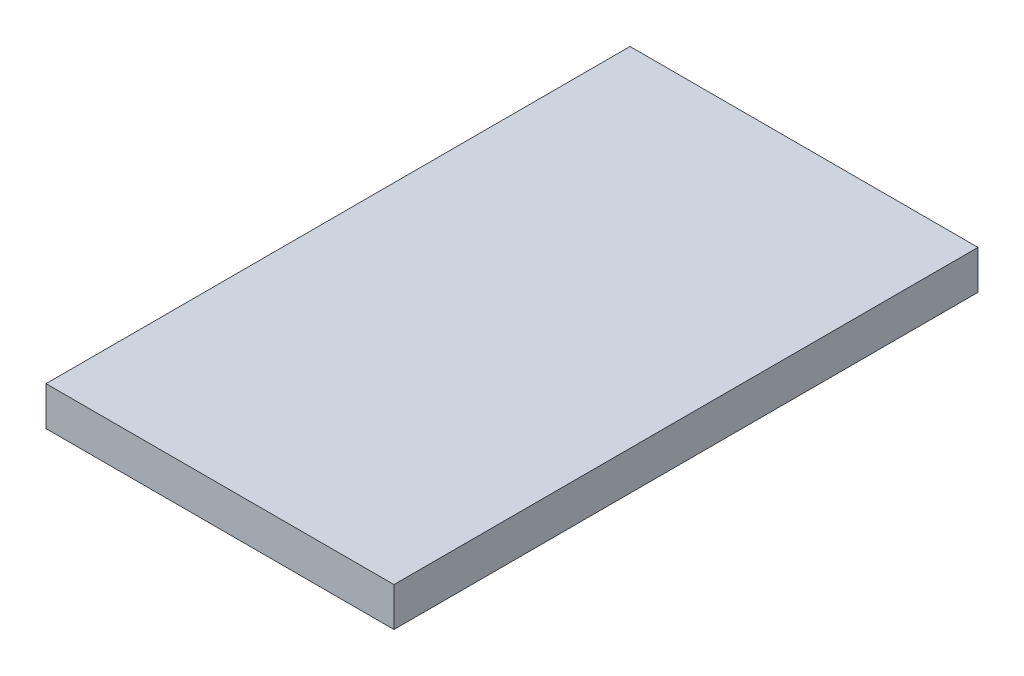
ISO-10303-21;
HEADER;
FILE_DESCRIPTION(('STEP AP214'),'2;1');
FILE_NAME('part.step','',(''),(''),'','','');
FILE_SCHEMA(('AUTOMOTIVE_DESIGN { 1 0 10303 214 1 1 1 1 }'));
ENDSEC;
DATA;
#1=APPLICATION_CONTEXT('core data for automotive mechanical design processes');
#2=APPLICATION_PROTOCOL_DEFINITION('international standard','automotive_design',2000,#1);
#3=PRODUCT_CONTEXT('',#1,'mechanical');
#4=PRODUCT('Part','Part','',(#3));
#5=PRODUCT_RELATED_PRODUCT_CATEGORY('part','',(#4));
#6=PRODUCT_DEFINITION_FORMATION('','',#4);
#7=PRODUCT_DEFINITION_CONTEXT('part definition',#1,'design');
#8=PRODUCT_DEFINITION('design','',#6,#7);
#9=PRODUCT_DEFINITION_SHAPE('','',#8);
#10=(LENGTH_UNIT() NAMED_UNIT(*) SI_UNIT(.MILLI.,.METRE.));
#11=(NAMED_UNIT(*) PLANE_ANGLE_UNIT() SI_UNIT($,.RADIAN.));
#12=(NAMED_UNIT(*) SI_UNIT($,.STERADIAN.) SOLID_ANGLE_UNIT());
#13=UNCERTAINTY_MEASURE_WITH_UNIT(LENGTH_MEASURE(1.E-05),#10,'distance_accuracy_value','');
#14=(GEOMETRIC_REPRESENTATION_CONTEXT(3) GLOBAL_UNCERTAINTY_ASSIGNED_CONTEXT((#13)) GLOBAL_UNIT_ASSIGNED_CONTEXT((#10,
#11,#12)) REPRESENTATION_CONTEXT('',''));
#15=CARTESIAN_POINT('',(0.,0.,0.));
#16=DIRECTION('',(0.,0.,1.));
#17=DIRECTION('',(1.,0.,0.));
#18=AXIS2_PLACEMENT_3D('',#15,#16,#17);
#19=CARTESIAN_POINT('',(-46.385499637755,20.32,-250.314345947891));
#20=DIRECTION('',(1.,0.,0.));
#21=DIRECTION('',(0.,0.,-1.));
#22=AXIS2_PLACEMENT_3D('',#19,#20,#21);
#23=PLANE('',#22);
#24=DIRECTION('',(0.,0.,1.));
#25=VECTOR('',#24,1.);
#26=CARTESIAN_POINT('',(-46.385499637755,0.,-250.314345947891));
#27=LINE('',#26,#25);
#28=CARTESIAN_POINT('',(-46.385499637755,0.,-250.314345947891));
#29=VERTEX_POINT('',#28);
#30=CARTESIAN_POINT('',(-46.3854996377549,0.,54.4856540521091));
#31=VERTEX_POINT('',#30);
#32=EDGE_CURVE('E113',#29,#31,#27,.T.);
#33=ORIENTED_EDGE('',*,*,#32,.T.);
#34=DIRECTION('',(0.,-1.,0.));
#35=VECTOR('',#34,1.);
#36=CARTESIAN_POINT('',(-46.3854996377549,20.32,54.4856540521091));
#37=LINE('',#36,#35);
#38=CARTESIAN_POINT('',(-46.3854996377549,20.32,54.4856540521091));
#39=VERTEX_POINT('',#38);
#40=EDGE_CURVE('E11',#39,#31,#37,.T.);
#41=ORIENTED_EDGE('',*,*,#40,.F.);
#42=DIRECTION('',(0.,0.,1.));
#43=VECTOR('',#42,1.);
#44=CARTESIAN_POINT('',(-46.385499637755,20.32,-250.314345947891));
#45=LINE('',#44,#43);
#46=CARTESIAN_POINT('',(-46.385499637755,20.32,-250.314345947891));
#47=VERTEX_POINT('',#46);
#48=EDGE_CURVE('E97',#47,#39,#45,.T.);
#49=ORIENTED_EDGE('',*,*,#48,.F.);
#50=DIRECTION('',(0.,-1.,0.));
#51=VECTOR('',#50,1.);
#52=CARTESIAN_POINT('',(-46.385499637755,20.32,-250.314345947891));
#53=LINE('',#52,#51);
#54=EDGE_CURVE('E109',#47,#29,#53,.T.);
#55=ORIENTED_EDGE('',*,*,#54,.T.);
#56=EDGE_LOOP('',(#33,#41,#49,#55));
#57=FACE_BOUND('',#56,.T.);
#58=ADVANCED_FACE('F45',(#57),#23,.F.);
#59=CARTESIAN_POINT('',(-46.3854996377549,20.32,54.4856540521091));
#60=DIRECTION('',(0.,0.,-1.));
#61=DIRECTION('',(-1.,0.,0.));
#62=AXIS2_PLACEMENT_3D('',#59,#60,#61);
#63=PLANE('',#62);
#64=DIRECTION('',(1.,0.,0.));
#65=VECTOR('',#64,1.);
#66=CARTESIAN_POINT('',(-46.3854996377549,0.,54.4856540521091));
#67=LINE('',#66,#65);
#68=CARTESIAN_POINT('',(135.224500362245,0.,54.4856540521091));
#69=VERTEX_POINT('',#68);
#70=EDGE_CURVE('E102',#31,#69,#67,.T.);
#71=ORIENTED_EDGE('',*,*,#70,.T.);
#72=DIRECTION('',(0.,-1.,0.));
#73=VECTOR('',#72,1.);
#74=CARTESIAN_POINT('',(135.224500362245,20.32,54.4856540521091));
#75=LINE('',#74,#73);
#76=CARTESIAN_POINT('',(135.224500362245,20.32,54.4856540521091));
#77=VERTEX_POINT('',#76);
#78=EDGE_CURVE('E54',#77,#69,#75,.T.);
#79=ORIENTED_EDGE('',*,*,#78,.F.);
#80=DIRECTION('',(1.,0.,0.));
#81=VECTOR('',#80,1.);
#82=CARTESIAN_POINT('',(-46.3854996377549,20.32,54.4856540521091));
#83=LINE('',#82,#81);
#84=EDGE_CURVE('E92',#39,#77,#83,.T.);
#85=ORIENTED_EDGE('',*,*,#84,.F.);
#86=ORIENTED_EDGE('',*,*,#40,.T.);
#87=EDGE_LOOP('',(#71,#79,#85,#86));
#88=FACE_BOUND('',#87,.T.);
#89=ADVANCED_FACE('F101',(#88),#63,.F.);
#90=CARTESIAN_POINT('',(135.224500362245,20.32,-250.314345947891));
#91=DIRECTION('',(-1.,0.,0.));
#92=DIRECTION('',(0.,0.,1.));
#93=AXIS2_PLACEMENT_3D('',#90,#91,#92);
#94=PLANE('',#93);
#95=DIRECTION('',(0.,0.,-1.));
#96=VECTOR('',#95,1.);
#97=CARTESIAN_POINT('',(135.224500362245,0.,-250.314345947891));
#98=LINE('',#97,#96);
#99=CARTESIAN_POINT('',(135.224500362245,0.,-250.314345947891));
#100=VERTEX_POINT('',#99);
#101=EDGE_CURVE('E79',#69,#100,#98,.T.);
#102=ORIENTED_EDGE('',*,*,#101,.T.);
#103=DIRECTION('',(0.,-1.,0.));
#104=VECTOR('',#103,1.);
#105=CARTESIAN_POINT('',(135.224500362245,20.32,-250.314345947891));
#106=LINE('',#105,#104);
#107=CARTESIAN_POINT('',(135.224500362245,20.32,-250.314345947891));
#108=VERTEX_POINT('',#107);
#109=EDGE_CURVE('E104',#108,#100,#106,.T.);
#110=ORIENTED_EDGE('',*,*,#109,.F.);
#111=DIRECTION('',(0.,0.,-1.));
#112=VECTOR('',#111,1.);
#113=CARTESIAN_POINT('',(135.224500362245,20.32,-250.314345947891));
#114=LINE('',#113,#112);
#115=EDGE_CURVE('E95',#77,#108,#114,.T.);
#116=ORIENTED_EDGE('',*,*,#115,.F.);
#117=ORIENTED_EDGE('',*,*,#78,.T.);
#118=EDGE_LOOP('',(#102,#110,#116,#117));
#119=FACE_BOUND('',#118,.T.);
#120=ADVANCED_FACE('F105',(#119),#94,.F.);
#121=CARTESIAN_POINT('',(-46.385499637755,20.32,-250.314345947891));
#122=DIRECTION('',(0.,0.,1.));
#123=DIRECTION('',(1.,0.,0.));
#124=AXIS2_PLACEMENT_3D('',#121,#122,#123);
#125=PLANE('',#124);
#126=DIRECTION('',(-1.,0.,0.));
#127=VECTOR('',#126,1.);
#128=CARTESIAN_POINT('',(-46.385499637755,0.,-250.314345947891));
#129=LINE('',#128,#127);
#130=EDGE_CURVE('E85',#100,#29,#129,.T.);
#131=ORIENTED_EDGE('',*,*,#130,.T.);
#132=ORIENTED_EDGE('',*,*,#54,.F.);
#133=DIRECTION('',(-1.,0.,0.));
#134=VECTOR('',#133,1.);
#135=CARTESIAN_POINT('',(-46.385499637755,20.32,-250.314345947891));
#136=LINE('',#135,#134);
#137=EDGE_CURVE('E62',#108,#47,#136,.T.);
#138=ORIENTED_EDGE('',*,*,#137,.F.);
#139=ORIENTED_EDGE('',*,*,#109,.T.);
#140=EDGE_LOOP('',(#131,#132,#138,#139));
#141=FACE_BOUND('',#140,.T.);
#142=ADVANCED_FACE('F126',(#141),#125,.F.);
#143=CARTESIAN_POINT('',(0.,20.32,0.));
#144=DIRECTION('',(0.,1.,0.));
#145=DIRECTION('',(0.,0.,1.));
#146=AXIS2_PLACEMENT_3D('',#143,#144,#145);
#147=PLANE('',#146);
#148=ORIENTED_EDGE('',*,*,#48,.T.);
#149=ORIENTED_EDGE('',*,*,#84,.T.);
#150=ORIENTED_EDGE('',*,*,#115,.T.);
#151=ORIENTED_EDGE('',*,*,#137,.T.);
#152=EDGE_LOOP('',(#148,#149,#150,#151));
#153=FACE_BOUND('',#152,.T.);
#154=ADVANCED_FACE('F93',(#153),#147,.T.);
#155=CARTESIAN_POINT('',(0.,0.,0.));
#156=DIRECTION('',(0.,1.,0.));
#157=DIRECTION('',(0.,0.,1.));
#158=AXIS2_PLACEMENT_3D('',#155,#156,#157);
#159=PLANE('',#158);
#160=ORIENTED_EDGE('',*,*,#32,.F.);
#161=ORIENTED_EDGE('',*,*,#130,.F.);
#162=ORIENTED_EDGE('',*,*,#101,.F.);
#163=ORIENTED_EDGE('',*,*,#70,.F.);
#164=EDGE_LOOP('',(#160,#161,#162,#163));
#165=FACE_BOUND('',#164,.T.);
#166=ADVANCED_FACE('F129',(#165),#159,.F.);
#167=CLOSED_SHELL('',(#58,#89,#120,#142,#154,#166));
#168=MANIFOLD_SOLID_BREP('B2',#167);
#169=ADVANCED_BREP_SHAPE_REPRESENTATION('',(#18,#168),#14);
#170=SHAPE_DEFINITION_REPRESENTATION(#9,#169);
ENDSEC;
END-ISO-10303-21;
